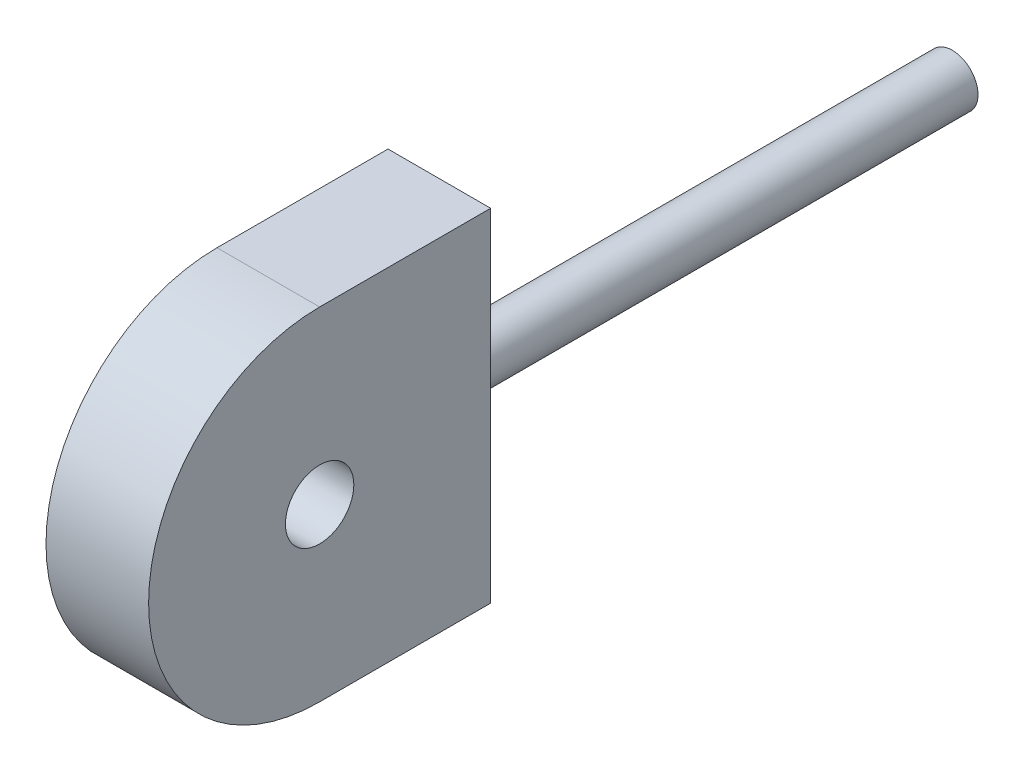
ISO-10303-21;
HEADER;
FILE_DESCRIPTION(('STEP AP214'),'2;1');
FILE_NAME('part.step','',(''),(''),'','','');
FILE_SCHEMA(('AUTOMOTIVE_DESIGN { 1 0 10303 214 1 1 1 1 }'));
ENDSEC;
DATA;
#1=APPLICATION_CONTEXT('core data for automotive mechanical design processes');
#2=APPLICATION_PROTOCOL_DEFINITION('international standard','automotive_design',2000,#1);
#3=PRODUCT_CONTEXT('',#1,'mechanical');
#4=PRODUCT('Part','Part','',(#3));
#5=PRODUCT_RELATED_PRODUCT_CATEGORY('part','',(#4));
#6=PRODUCT_DEFINITION_FORMATION('','',#4);
#7=PRODUCT_DEFINITION_CONTEXT('part definition',#1,'design');
#8=PRODUCT_DEFINITION('design','',#6,#7);
#9=PRODUCT_DEFINITION_SHAPE('','',#8);
#10=(LENGTH_UNIT() NAMED_UNIT(*) SI_UNIT(.MILLI.,.METRE.));
#11=(NAMED_UNIT(*) PLANE_ANGLE_UNIT() SI_UNIT($,.RADIAN.));
#12=(NAMED_UNIT(*) SI_UNIT($,.STERADIAN.) SOLID_ANGLE_UNIT());
#13=UNCERTAINTY_MEASURE_WITH_UNIT(LENGTH_MEASURE(1.E-05),#10,'distance_accuracy_value','');
#14=(GEOMETRIC_REPRESENTATION_CONTEXT(3) GLOBAL_UNCERTAINTY_ASSIGNED_CONTEXT((#13)) GLOBAL_UNIT_ASSIGNED_CONTEXT((#10,
#11,#12)) REPRESENTATION_CONTEXT('',''));
#15=CARTESIAN_POINT('',(0.,0.,0.));
#16=DIRECTION('',(0.,0.,1.));
#17=DIRECTION('',(1.,0.,0.));
#18=AXIS2_PLACEMENT_3D('',#15,#16,#17);
#19=CARTESIAN_POINT('',(-3.,0.,0.));
#20=DIRECTION('',(1.,0.,0.));
#21=DIRECTION('',(0.,0.,-1.));
#22=AXIS2_PLACEMENT_3D('',#19,#20,#21);
#23=CYLINDRICAL_SURFACE('',#22,10.);
#24=DIRECTION('',(1.,0.,0.));
#25=VECTOR('',#24,1.);
#26=CARTESIAN_POINT('',(-3.,-10.,0.));
#27=LINE('',#26,#25);
#28=CARTESIAN_POINT('',(-3.,-10.,0.));
#29=VERTEX_POINT('',#28);
#30=CARTESIAN_POINT('',(3.,-10.,0.));
#31=VERTEX_POINT('',#30);
#32=EDGE_CURVE('E77',#29,#31,#27,.T.);
#33=ORIENTED_EDGE('',*,*,#32,.T.);
#34=CARTESIAN_POINT('',(3.,0.,0.));
#35=DIRECTION('',(1.,0.,0.));
#36=DIRECTION('',(0.,0.,-1.));
#37=AXIS2_PLACEMENT_3D('',#34,#35,#36);
#38=CIRCLE('',#37,10.);
#39=CARTESIAN_POINT('',(3.,10.,0.));
#40=VERTEX_POINT('',#39);
#41=EDGE_CURVE('E79',#40,#31,#38,.T.);
#42=ORIENTED_EDGE('',*,*,#41,.F.);
#43=DIRECTION('',(1.,0.,0.));
#44=VECTOR('',#43,1.);
#45=CARTESIAN_POINT('',(-3.,10.,0.));
#46=LINE('',#45,#44);
#47=CARTESIAN_POINT('',(-3.,10.,0.));
#48=VERTEX_POINT('',#47);
#49=EDGE_CURVE('E45',#48,#40,#46,.T.);
#50=ORIENTED_EDGE('',*,*,#49,.F.);
#51=CARTESIAN_POINT('',(-3.,0.,0.));
#52=DIRECTION('',(1.,0.,0.));
#53=DIRECTION('',(0.,0.,-1.));
#54=AXIS2_PLACEMENT_3D('',#51,#52,#53);
#55=CIRCLE('',#54,10.);
#56=EDGE_CURVE('E80',#48,#29,#55,.T.);
#57=ORIENTED_EDGE('',*,*,#56,.T.);
#58=EDGE_LOOP('',(#33,#42,#50,#57));
#59=FACE_BOUND('',#58,.T.);
#60=ADVANCED_FACE('F37',(#59),#23,.T.);
#61=CARTESIAN_POINT('',(-3.,10.,0.));
#62=DIRECTION('',(0.,1.,0.));
#63=DIRECTION('',(0.,0.,1.));
#64=AXIS2_PLACEMENT_3D('',#61,#62,#63);
#65=PLANE('',#64);
#66=ORIENTED_EDGE('',*,*,#49,.T.);
#67=DIRECTION('',(0.,0.,1.));
#68=VECTOR('',#67,1.);
#69=CARTESIAN_POINT('',(3.,10.,0.));
#70=LINE('',#69,#68);
#71=CARTESIAN_POINT('',(3.,10.,-10.));
#72=VERTEX_POINT('',#71);
#73=EDGE_CURVE('E92',#72,#40,#70,.T.);
#74=ORIENTED_EDGE('',*,*,#73,.F.);
#75=DIRECTION('',(1.,0.,0.));
#76=VECTOR('',#75,1.);
#77=CARTESIAN_POINT('',(-3.,10.,-10.));
#78=LINE('',#77,#76);
#79=CARTESIAN_POINT('',(-3.,10.,-10.));
#80=VERTEX_POINT('',#79);
#81=EDGE_CURVE('E59',#80,#72,#78,.T.);
#82=ORIENTED_EDGE('',*,*,#81,.F.);
#83=DIRECTION('',(0.,0.,1.));
#84=VECTOR('',#83,1.);
#85=CARTESIAN_POINT('',(-3.,10.,0.));
#86=LINE('',#85,#84);
#87=EDGE_CURVE('E84',#80,#48,#86,.T.);
#88=ORIENTED_EDGE('',*,*,#87,.T.);
#89=EDGE_LOOP('',(#66,#74,#82,#88));
#90=FACE_BOUND('',#89,.T.);
#91=ADVANCED_FACE('F118',(#90),#65,.T.);
#92=CARTESIAN_POINT('',(-3.,0.,-10.));
#93=DIRECTION('',(0.,0.,1.));
#94=DIRECTION('',(0.,-1.,0.));
#95=AXIS2_PLACEMENT_3D('',#92,#93,#94);
#96=PLANE('',#95);
#97=CARTESIAN_POINT('',(0.,0.,-10.));
#98=DIRECTION('',(0.,0.,1.));
#99=DIRECTION('',(0.,-1.,0.));
#100=AXIS2_PLACEMENT_3D('',#97,#98,#99);
#101=CIRCLE('',#100,1.5);
#102=CARTESIAN_POINT('',(0.,-1.5,-10.));
#103=VERTEX_POINT('',#102);
#104=EDGE_CURVE('E11',#103,#103,#101,.F.);
#105=ORIENTED_EDGE('',*,*,#104,.F.);
#106=EDGE_LOOP('',(#105));
#107=FACE_BOUND('',#106,.T.);
#108=ORIENTED_EDGE('',*,*,#81,.T.);
#109=DIRECTION('',(0.,-1.,0.));
#110=VECTOR('',#109,1.);
#111=CARTESIAN_POINT('',(3.,0.,-10.));
#112=LINE('',#111,#110);
#113=CARTESIAN_POINT('',(3.,-10.,-10.));
#114=VERTEX_POINT('',#113);
#115=EDGE_CURVE('E97',#72,#114,#112,.T.);
#116=ORIENTED_EDGE('',*,*,#115,.T.);
#117=DIRECTION('',(1.,0.,0.));
#118=VECTOR('',#117,1.);
#119=CARTESIAN_POINT('',(-3.,-10.,-10.));
#120=LINE('',#119,#118);
#121=CARTESIAN_POINT('',(-3.,-10.,-10.));
#122=VERTEX_POINT('',#121);
#123=EDGE_CURVE('E83',#122,#114,#120,.T.);
#124=ORIENTED_EDGE('',*,*,#123,.F.);
#125=DIRECTION('',(0.,-1.,0.));
#126=VECTOR('',#125,1.);
#127=CARTESIAN_POINT('',(-3.,0.,-10.));
#128=LINE('',#127,#126);
#129=EDGE_CURVE('E109',#80,#122,#128,.T.);
#130=ORIENTED_EDGE('',*,*,#129,.F.);
#131=EDGE_LOOP('',(#108,#116,#124,#130));
#132=FACE_BOUND('',#131,.T.);
#133=ADVANCED_FACE('F116',(#107,#132),#96,.F.);
#134=CARTESIAN_POINT('',(-3.,0.,0.));
#135=DIRECTION('',(1.,0.,0.));
#136=DIRECTION('',(0.,0.,-1.));
#137=AXIS2_PLACEMENT_3D('',#134,#135,#136);
#138=CYLINDRICAL_SURFACE('',#137,2.);
#139=CARTESIAN_POINT('',(-3.,0.,0.));
#140=DIRECTION('',(1.,0.,0.));
#141=DIRECTION('',(0.,0.,-1.));
#142=AXIS2_PLACEMENT_3D('',#139,#140,#141);
#143=CIRCLE('',#142,2.);
#144=CARTESIAN_POINT('',(-3.,0.,-2.));
#145=VERTEX_POINT('',#144);
#146=EDGE_CURVE('E103',#145,#145,#143,.T.);
#147=ORIENTED_EDGE('',*,*,#146,.F.);
#148=EDGE_LOOP('',(#147));
#149=FACE_BOUND('',#148,.T.);
#150=CARTESIAN_POINT('',(3.,0.,0.));
#151=DIRECTION('',(1.,0.,0.));
#152=DIRECTION('',(0.,0.,-1.));
#153=AXIS2_PLACEMENT_3D('',#150,#151,#152);
#154=CIRCLE('',#153,2.);
#155=CARTESIAN_POINT('',(3.,0.,-2.));
#156=VERTEX_POINT('',#155);
#157=EDGE_CURVE('E93',#156,#156,#154,.T.);
#158=ORIENTED_EDGE('',*,*,#157,.T.);
#159=EDGE_LOOP('',(#158));
#160=FACE_BOUND('',#159,.T.);
#161=ADVANCED_FACE('F39',(#149,#160),#138,.F.);
#162=CARTESIAN_POINT('',(-3.,-10.,0.));
#163=DIRECTION('',(0.,1.,0.));
#164=DIRECTION('',(0.,0.,1.));
#165=AXIS2_PLACEMENT_3D('',#162,#163,#164);
#166=PLANE('',#165);
#167=ORIENTED_EDGE('',*,*,#123,.T.);
#168=DIRECTION('',(0.,0.,1.));
#169=VECTOR('',#168,1.);
#170=CARTESIAN_POINT('',(3.,-10.,0.));
#171=LINE('',#170,#169);
#172=EDGE_CURVE('E90',#114,#31,#171,.T.);
#173=ORIENTED_EDGE('',*,*,#172,.T.);
#174=ORIENTED_EDGE('',*,*,#32,.F.);
#175=DIRECTION('',(0.,0.,1.));
#176=VECTOR('',#175,1.);
#177=CARTESIAN_POINT('',(-3.,-10.,0.));
#178=LINE('',#177,#176);
#179=EDGE_CURVE('E107',#122,#29,#178,.T.);
#180=ORIENTED_EDGE('',*,*,#179,.F.);
#181=EDGE_LOOP('',(#167,#173,#174,#180));
#182=FACE_BOUND('',#181,.T.);
#183=ADVANCED_FACE('F95',(#182),#166,.F.);
#184=CARTESIAN_POINT('',(-3.,0.,0.));
#185=DIRECTION('',(1.,0.,0.));
#186=DIRECTION('',(0.,0.,-1.));
#187=AXIS2_PLACEMENT_3D('',#184,#185,#186);
#188=PLANE('',#187);
#189=ORIENTED_EDGE('',*,*,#146,.T.);
#190=EDGE_LOOP('',(#189));
#191=FACE_BOUND('',#190,.T.);
#192=ORIENTED_EDGE('',*,*,#56,.F.);
#193=ORIENTED_EDGE('',*,*,#87,.F.);
#194=ORIENTED_EDGE('',*,*,#129,.T.);
#195=ORIENTED_EDGE('',*,*,#179,.T.);
#196=EDGE_LOOP('',(#192,#193,#194,#195));
#197=FACE_BOUND('',#196,.T.);
#198=ADVANCED_FACE('F120',(#191,#197),#188,.F.);
#199=CARTESIAN_POINT('',(3.,0.,0.));
#200=DIRECTION('',(1.,0.,0.));
#201=DIRECTION('',(0.,0.,-1.));
#202=AXIS2_PLACEMENT_3D('',#199,#200,#201);
#203=PLANE('',#202);
#204=ORIENTED_EDGE('',*,*,#157,.F.);
#205=EDGE_LOOP('',(#204));
#206=FACE_BOUND('',#205,.T.);
#207=ORIENTED_EDGE('',*,*,#41,.T.);
#208=ORIENTED_EDGE('',*,*,#172,.F.);
#209=ORIENTED_EDGE('',*,*,#115,.F.);
#210=ORIENTED_EDGE('',*,*,#73,.T.);
#211=EDGE_LOOP('',(#207,#208,#209,#210));
#212=FACE_BOUND('',#211,.T.);
#213=ADVANCED_FACE('F88',(#206,#212),#203,.T.);
#214=CARTESIAN_POINT('',(0.,0.,-40.));
#215=DIRECTION('',(0.,0.,1.));
#216=DIRECTION('',(0.,-1.,0.));
#217=AXIS2_PLACEMENT_3D('',#214,#215,#216);
#218=CYLINDRICAL_SURFACE('',#217,1.5);
#219=CARTESIAN_POINT('',(0.,0.,-40.));
#220=DIRECTION('',(0.,0.,-1.));
#221=DIRECTION('',(0.,1.,0.));
#222=AXIS2_PLACEMENT_3D('',#219,#220,#221);
#223=CIRCLE('',#222,1.5);
#224=CARTESIAN_POINT('',(0.,1.5,-40.));
#225=VERTEX_POINT('',#224);
#226=EDGE_CURVE('E157',#225,#225,#223,.T.);
#227=ORIENTED_EDGE('',*,*,#226,.F.);
#228=EDGE_LOOP('',(#227));
#229=FACE_BOUND('',#228,.T.);
#230=ORIENTED_EDGE('',*,*,#104,.T.);
#231=EDGE_LOOP('',(#230));
#232=FACE_BOUND('',#231,.T.);
#233=ADVANCED_FACE('F128',(#229,#232),#218,.T.);
#234=CARTESIAN_POINT('',(0.,0.,-40.));
#235=DIRECTION('',(0.,0.,-1.));
#236=DIRECTION('',(0.,1.,0.));
#237=AXIS2_PLACEMENT_3D('',#234,#235,#236);
#238=PLANE('',#237);
#239=ORIENTED_EDGE('',*,*,#226,.T.);
#240=EDGE_LOOP('',(#239));
#241=FACE_BOUND('',#240,.T.);
#242=ADVANCED_FACE('F147',(#241),#238,.T.);
#243=CLOSED_SHELL('',(#60,#91,#133,#161,#183,#198,#213,#233,#242));
#244=MANIFOLD_SOLID_BREP('B2',#243);
#245=ADVANCED_BREP_SHAPE_REPRESENTATION('',(#18,#244),#14);
#246=SHAPE_DEFINITION_REPRESENTATION(#9,#245);
ENDSEC;
END-ISO-10303-21;
